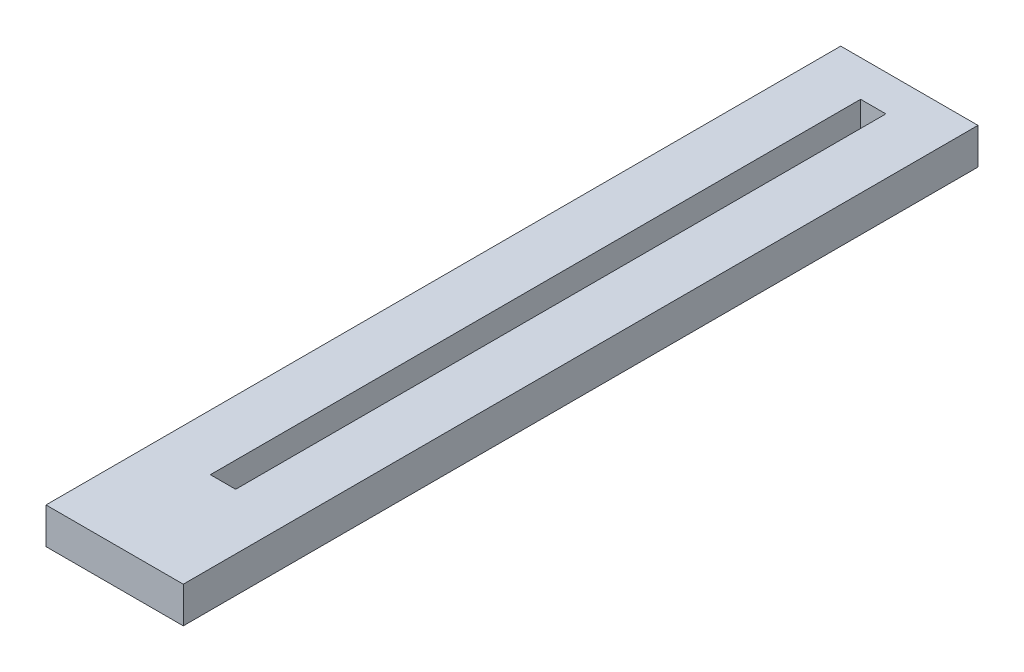
ISO-10303-21;
HEADER;
FILE_DESCRIPTION(('STEP AP214'),'2;1');
FILE_NAME('part.step','',(''),(''),'','','');
FILE_SCHEMA(('AUTOMOTIVE_DESIGN { 1 0 10303 214 1 1 1 1 }'));
ENDSEC;
DATA;
#1=APPLICATION_CONTEXT('core data for automotive mechanical design processes');
#2=APPLICATION_PROTOCOL_DEFINITION('international standard','automotive_design',2000,#1);
#3=PRODUCT_CONTEXT('',#1,'mechanical');
#4=PRODUCT('Part','Part','',(#3));
#5=PRODUCT_RELATED_PRODUCT_CATEGORY('part','',(#4));
#6=PRODUCT_DEFINITION_FORMATION('','',#4);
#7=PRODUCT_DEFINITION_CONTEXT('part definition',#1,'design');
#8=PRODUCT_DEFINITION('design','',#6,#7);
#9=PRODUCT_DEFINITION_SHAPE('','',#8);
#10=(LENGTH_UNIT() NAMED_UNIT(*) SI_UNIT(.MILLI.,.METRE.));
#11=(NAMED_UNIT(*) PLANE_ANGLE_UNIT() SI_UNIT($,.RADIAN.));
#12=(NAMED_UNIT(*) SI_UNIT($,.STERADIAN.) SOLID_ANGLE_UNIT());
#13=UNCERTAINTY_MEASURE_WITH_UNIT(LENGTH_MEASURE(1.E-05),#10,'distance_accuracy_value','');
#14=(GEOMETRIC_REPRESENTATION_CONTEXT(3) GLOBAL_UNCERTAINTY_ASSIGNED_CONTEXT((#13)) GLOBAL_UNIT_ASSIGNED_CONTEXT((#10,
#11,#12)) REPRESENTATION_CONTEXT('',''));
#15=CARTESIAN_POINT('',(0.,0.,0.));
#16=DIRECTION('',(0.,0.,1.));
#17=DIRECTION('',(1.,0.,0.));
#18=AXIS2_PLACEMENT_3D('',#15,#16,#17);
#19=CARTESIAN_POINT('',(0.,5.,0.));
#20=DIRECTION('',(0.,1.,0.));
#21=DIRECTION('',(0.,0.,1.));
#22=AXIS2_PLACEMENT_3D('',#19,#20,#21);
#23=PLANE('',#22);
#24=DIRECTION('',(0.,0.,-1.));
#25=VECTOR('',#24,1.);
#26=CARTESIAN_POINT('',(0.,5.,0.));
#27=LINE('',#26,#25);
#28=CARTESIAN_POINT('',(0.,5.,0.));
#29=VERTEX_POINT('',#28);
#30=CARTESIAN_POINT('',(0.,5.,-110.));
#31=VERTEX_POINT('',#30);
#32=EDGE_CURVE('E157',#29,#31,#27,.T.);
#33=ORIENTED_EDGE('',*,*,#32,.T.);
#34=DIRECTION('',(-1.,0.,0.));
#35=VECTOR('',#34,1.);
#36=CARTESIAN_POINT('',(0.,5.,-110.));
#37=LINE('',#36,#35);
#38=CARTESIAN_POINT('',(-19.,5.,-110.));
#39=VERTEX_POINT('',#38);
#40=EDGE_CURVE('E161',#31,#39,#37,.T.);
#41=ORIENTED_EDGE('',*,*,#40,.T.);
#42=DIRECTION('',(0.,0.,1.));
#43=VECTOR('',#42,1.);
#44=CARTESIAN_POINT('',(-19.,5.,0.));
#45=LINE('',#44,#43);
#46=CARTESIAN_POINT('',(-19.,5.,0.));
#47=VERTEX_POINT('',#46);
#48=EDGE_CURVE('E165',#39,#47,#45,.T.);
#49=ORIENTED_EDGE('',*,*,#48,.T.);
#50=DIRECTION('',(1.,0.,0.));
#51=VECTOR('',#50,1.);
#52=CARTESIAN_POINT('',(0.,5.,0.));
#53=LINE('',#52,#51);
#54=EDGE_CURVE('E168',#47,#29,#53,.T.);
#55=ORIENTED_EDGE('',*,*,#54,.T.);
#56=EDGE_LOOP('',(#33,#41,#49,#55));
#57=FACE_BOUND('',#56,.T.);
#58=DIRECTION('',(1.,0.,0.));
#59=VECTOR('',#58,1.);
#60=CARTESIAN_POINT('',(-11.25,5.,-15.));
#61=LINE('',#60,#59);
#62=CARTESIAN_POINT('',(-11.25,5.,-15.));
#63=VERTEX_POINT('',#62);
#64=CARTESIAN_POINT('',(-7.75,5.,-15.));
#65=VERTEX_POINT('',#64);
#66=EDGE_CURVE('E118',#63,#65,#61,.T.);
#67=ORIENTED_EDGE('',*,*,#66,.F.);
#68=DIRECTION('',(0.,0.,1.));
#69=VECTOR('',#68,1.);
#70=CARTESIAN_POINT('',(-11.25,5.,-105.));
#71=LINE('',#70,#69);
#72=CARTESIAN_POINT('',(-11.25,5.,-105.));
#73=VERTEX_POINT('',#72);
#74=EDGE_CURVE('E109',#73,#63,#71,.T.);
#75=ORIENTED_EDGE('',*,*,#74,.F.);
#76=DIRECTION('',(-1.,0.,0.));
#77=VECTOR('',#76,1.);
#78=CARTESIAN_POINT('',(-11.25,5.,-105.));
#79=LINE('',#78,#77);
#80=CARTESIAN_POINT('',(-7.75,5.,-105.));
#81=VERTEX_POINT('',#80);
#82=EDGE_CURVE('E135',#81,#73,#79,.T.);
#83=ORIENTED_EDGE('',*,*,#82,.F.);
#84=DIRECTION('',(0.,0.,-1.));
#85=VECTOR('',#84,1.);
#86=CARTESIAN_POINT('',(-7.75,5.,-105.));
#87=LINE('',#86,#85);
#88=EDGE_CURVE('E131',#65,#81,#87,.T.);
#89=ORIENTED_EDGE('',*,*,#88,.F.);
#90=EDGE_LOOP('',(#67,#75,#83,#89));
#91=FACE_BOUND('',#90,.T.);
#92=ADVANCED_FACE('F43',(#57,#91),#23,.T.);
#93=CARTESIAN_POINT('',(0.,0.,0.));
#94=DIRECTION('',(0.,1.,0.));
#95=DIRECTION('',(0.,0.,1.));
#96=AXIS2_PLACEMENT_3D('',#93,#94,#95);
#97=PLANE('',#96);
#98=DIRECTION('',(0.,0.,-1.));
#99=VECTOR('',#98,1.);
#100=CARTESIAN_POINT('',(0.,0.,0.));
#101=LINE('',#100,#99);
#102=CARTESIAN_POINT('',(0.,0.,0.));
#103=VERTEX_POINT('',#102);
#104=CARTESIAN_POINT('',(0.,0.,-110.));
#105=VERTEX_POINT('',#104);
#106=EDGE_CURVE('E127',#103,#105,#101,.T.);
#107=ORIENTED_EDGE('',*,*,#106,.F.);
#108=DIRECTION('',(1.,0.,0.));
#109=VECTOR('',#108,1.);
#110=CARTESIAN_POINT('',(0.,0.,0.));
#111=LINE('',#110,#109);
#112=CARTESIAN_POINT('',(-19.,0.,0.));
#113=VERTEX_POINT('',#112);
#114=EDGE_CURVE('E162',#113,#103,#111,.T.);
#115=ORIENTED_EDGE('',*,*,#114,.F.);
#116=DIRECTION('',(0.,0.,1.));
#117=VECTOR('',#116,1.);
#118=CARTESIAN_POINT('',(-19.,0.,0.));
#119=LINE('',#118,#117);
#120=CARTESIAN_POINT('',(-19.,0.,-110.));
#121=VERTEX_POINT('',#120);
#122=EDGE_CURVE('E178',#121,#113,#119,.T.);
#123=ORIENTED_EDGE('',*,*,#122,.F.);
#124=DIRECTION('',(-1.,0.,0.));
#125=VECTOR('',#124,1.);
#126=CARTESIAN_POINT('',(0.,0.,-110.));
#127=LINE('',#126,#125);
#128=EDGE_CURVE('E175',#105,#121,#127,.T.);
#129=ORIENTED_EDGE('',*,*,#128,.F.);
#130=EDGE_LOOP('',(#107,#115,#123,#129));
#131=FACE_BOUND('',#130,.T.);
#132=DIRECTION('',(0.,0.,1.));
#133=VECTOR('',#132,1.);
#134=CARTESIAN_POINT('',(-11.25,0.,-105.));
#135=LINE('',#134,#133);
#136=CARTESIAN_POINT('',(-11.25,0.,-105.));
#137=VERTEX_POINT('',#136);
#138=CARTESIAN_POINT('',(-11.25,0.,-15.));
#139=VERTEX_POINT('',#138);
#140=EDGE_CURVE('E67',#137,#139,#135,.T.);
#141=ORIENTED_EDGE('',*,*,#140,.T.);
#142=DIRECTION('',(1.,0.,0.));
#143=VECTOR('',#142,1.);
#144=CARTESIAN_POINT('',(-11.25,0.,-15.));
#145=LINE('',#144,#143);
#146=CARTESIAN_POINT('',(-7.75,0.,-15.));
#147=VERTEX_POINT('',#146);
#148=EDGE_CURVE('E125',#139,#147,#145,.T.);
#149=ORIENTED_EDGE('',*,*,#148,.T.);
#150=DIRECTION('',(0.,0.,-1.));
#151=VECTOR('',#150,1.);
#152=CARTESIAN_POINT('',(-7.75,0.,-105.));
#153=LINE('',#152,#151);
#154=CARTESIAN_POINT('',(-7.75,0.,-105.));
#155=VERTEX_POINT('',#154);
#156=EDGE_CURVE('E144',#147,#155,#153,.T.);
#157=ORIENTED_EDGE('',*,*,#156,.T.);
#158=DIRECTION('',(-1.,0.,0.));
#159=VECTOR('',#158,1.);
#160=CARTESIAN_POINT('',(-11.25,0.,-105.));
#161=LINE('',#160,#159);
#162=EDGE_CURVE('E119',#155,#137,#161,.T.);
#163=ORIENTED_EDGE('',*,*,#162,.T.);
#164=EDGE_LOOP('',(#141,#149,#157,#163));
#165=FACE_BOUND('',#164,.T.);
#166=ADVANCED_FACE('F201',(#131,#165),#97,.F.);
#167=CARTESIAN_POINT('',(0.,5.,0.));
#168=DIRECTION('',(-1.,0.,0.));
#169=DIRECTION('',(0.,0.,1.));
#170=AXIS2_PLACEMENT_3D('',#167,#168,#169);
#171=PLANE('',#170);
#172=ORIENTED_EDGE('',*,*,#106,.T.);
#173=DIRECTION('',(0.,-1.,0.));
#174=VECTOR('',#173,1.);
#175=CARTESIAN_POINT('',(0.,5.,-110.));
#176=LINE('',#175,#174);
#177=EDGE_CURVE('E11',#31,#105,#176,.T.);
#178=ORIENTED_EDGE('',*,*,#177,.F.);
#179=ORIENTED_EDGE('',*,*,#32,.F.);
#180=DIRECTION('',(0.,-1.,0.));
#181=VECTOR('',#180,1.);
#182=CARTESIAN_POINT('',(0.,5.,0.));
#183=LINE('',#182,#181);
#184=EDGE_CURVE('E171',#29,#103,#183,.T.);
#185=ORIENTED_EDGE('',*,*,#184,.T.);
#186=EDGE_LOOP('',(#172,#178,#179,#185));
#187=FACE_BOUND('',#186,.T.);
#188=ADVANCED_FACE('F45',(#187),#171,.F.);
#189=CARTESIAN_POINT('',(0.,5.,-110.));
#190=DIRECTION('',(0.,0.,1.));
#191=DIRECTION('',(1.,0.,0.));
#192=AXIS2_PLACEMENT_3D('',#189,#190,#191);
#193=PLANE('',#192);
#194=ORIENTED_EDGE('',*,*,#128,.T.);
#195=DIRECTION('',(0.,-1.,0.));
#196=VECTOR('',#195,1.);
#197=CARTESIAN_POINT('',(-19.,5.,-110.));
#198=LINE('',#197,#196);
#199=EDGE_CURVE('E52',#39,#121,#198,.T.);
#200=ORIENTED_EDGE('',*,*,#199,.F.);
#201=ORIENTED_EDGE('',*,*,#40,.F.);
#202=ORIENTED_EDGE('',*,*,#177,.T.);
#203=EDGE_LOOP('',(#194,#200,#201,#202));
#204=FACE_BOUND('',#203,.T.);
#205=ADVANCED_FACE('F211',(#204),#193,.F.);
#206=CARTESIAN_POINT('',(-19.,5.,0.));
#207=DIRECTION('',(1.,0.,0.));
#208=DIRECTION('',(0.,0.,-1.));
#209=AXIS2_PLACEMENT_3D('',#206,#207,#208);
#210=PLANE('',#209);
#211=ORIENTED_EDGE('',*,*,#122,.T.);
#212=DIRECTION('',(0.,-1.,0.));
#213=VECTOR('',#212,1.);
#214=CARTESIAN_POINT('',(-19.,5.,0.));
#215=LINE('',#214,#213);
#216=EDGE_CURVE('E186',#47,#113,#215,.T.);
#217=ORIENTED_EDGE('',*,*,#216,.F.);
#218=ORIENTED_EDGE('',*,*,#48,.F.);
#219=ORIENTED_EDGE('',*,*,#199,.T.);
#220=EDGE_LOOP('',(#211,#217,#218,#219));
#221=FACE_BOUND('',#220,.T.);
#222=ADVANCED_FACE('F195',(#221),#210,.F.);
#223=CARTESIAN_POINT('',(0.,5.,0.));
#224=DIRECTION('',(0.,0.,-1.));
#225=DIRECTION('',(-1.,0.,0.));
#226=AXIS2_PLACEMENT_3D('',#223,#224,#225);
#227=PLANE('',#226);
#228=ORIENTED_EDGE('',*,*,#114,.T.);
#229=ORIENTED_EDGE('',*,*,#184,.F.);
#230=ORIENTED_EDGE('',*,*,#54,.F.);
#231=ORIENTED_EDGE('',*,*,#216,.T.);
#232=EDGE_LOOP('',(#228,#229,#230,#231));
#233=FACE_BOUND('',#232,.T.);
#234=ADVANCED_FACE('F205',(#233),#227,.F.);
#235=CARTESIAN_POINT('',(-11.25,5.,-105.));
#236=DIRECTION('',(1.,0.,0.));
#237=DIRECTION('',(0.,0.,-1.));
#238=AXIS2_PLACEMENT_3D('',#235,#236,#237);
#239=PLANE('',#238);
#240=ORIENTED_EDGE('',*,*,#140,.F.);
#241=DIRECTION('',(0.,-1.,0.));
#242=VECTOR('',#241,1.);
#243=CARTESIAN_POINT('',(-11.25,5.,-105.));
#244=LINE('',#243,#242);
#245=EDGE_CURVE('E113',#73,#137,#244,.T.);
#246=ORIENTED_EDGE('',*,*,#245,.F.);
#247=ORIENTED_EDGE('',*,*,#74,.T.);
#248=DIRECTION('',(0.,-1.,0.));
#249=VECTOR('',#248,1.);
#250=CARTESIAN_POINT('',(-11.25,5.,-15.));
#251=LINE('',#250,#249);
#252=EDGE_CURVE('E112',#63,#139,#251,.T.);
#253=ORIENTED_EDGE('',*,*,#252,.T.);
#254=EDGE_LOOP('',(#240,#246,#247,#253));
#255=FACE_BOUND('',#254,.T.);
#256=ADVANCED_FACE('F111',(#255),#239,.T.);
#257=CARTESIAN_POINT('',(-11.25,5.,-15.));
#258=DIRECTION('',(0.,0.,-1.));
#259=DIRECTION('',(-1.,0.,0.));
#260=AXIS2_PLACEMENT_3D('',#257,#258,#259);
#261=PLANE('',#260);
#262=ORIENTED_EDGE('',*,*,#148,.F.);
#263=ORIENTED_EDGE('',*,*,#252,.F.);
#264=ORIENTED_EDGE('',*,*,#66,.T.);
#265=DIRECTION('',(0.,-1.,0.));
#266=VECTOR('',#265,1.);
#267=CARTESIAN_POINT('',(-7.75,5.,-15.));
#268=LINE('',#267,#266);
#269=EDGE_CURVE('E128',#65,#147,#268,.T.);
#270=ORIENTED_EDGE('',*,*,#269,.T.);
#271=EDGE_LOOP('',(#262,#263,#264,#270));
#272=FACE_BOUND('',#271,.T.);
#273=ADVANCED_FACE('F122',(#272),#261,.T.);
#274=CARTESIAN_POINT('',(-7.75,5.,-105.));
#275=DIRECTION('',(-1.,0.,0.));
#276=DIRECTION('',(0.,0.,1.));
#277=AXIS2_PLACEMENT_3D('',#274,#275,#276);
#278=PLANE('',#277);
#279=ORIENTED_EDGE('',*,*,#156,.F.);
#280=ORIENTED_EDGE('',*,*,#269,.F.);
#281=ORIENTED_EDGE('',*,*,#88,.T.);
#282=DIRECTION('',(0.,-1.,0.));
#283=VECTOR('',#282,1.);
#284=CARTESIAN_POINT('',(-7.75,5.,-105.));
#285=LINE('',#284,#283);
#286=EDGE_CURVE('E59',#81,#155,#285,.T.);
#287=ORIENTED_EDGE('',*,*,#286,.T.);
#288=EDGE_LOOP('',(#279,#280,#281,#287));
#289=FACE_BOUND('',#288,.T.);
#290=ADVANCED_FACE('F234',(#289),#278,.T.);
#291=CARTESIAN_POINT('',(-11.25,5.,-105.));
#292=DIRECTION('',(0.,0.,1.));
#293=DIRECTION('',(1.,0.,0.));
#294=AXIS2_PLACEMENT_3D('',#291,#292,#293);
#295=PLANE('',#294);
#296=ORIENTED_EDGE('',*,*,#162,.F.);
#297=ORIENTED_EDGE('',*,*,#286,.F.);
#298=ORIENTED_EDGE('',*,*,#82,.T.);
#299=ORIENTED_EDGE('',*,*,#245,.T.);
#300=EDGE_LOOP('',(#296,#297,#298,#299));
#301=FACE_BOUND('',#300,.T.);
#302=ADVANCED_FACE('F238',(#301),#295,.T.);
#303=CLOSED_SHELL('',(#92,#166,#188,#205,#222,#234,#256,#273,#290,#302));
#304=MANIFOLD_SOLID_BREP('B2',#303);
#305=ADVANCED_BREP_SHAPE_REPRESENTATION('',(#18,#304),#14);
#306=SHAPE_DEFINITION_REPRESENTATION(#9,#305);
ENDSEC;
END-ISO-10303-21;
